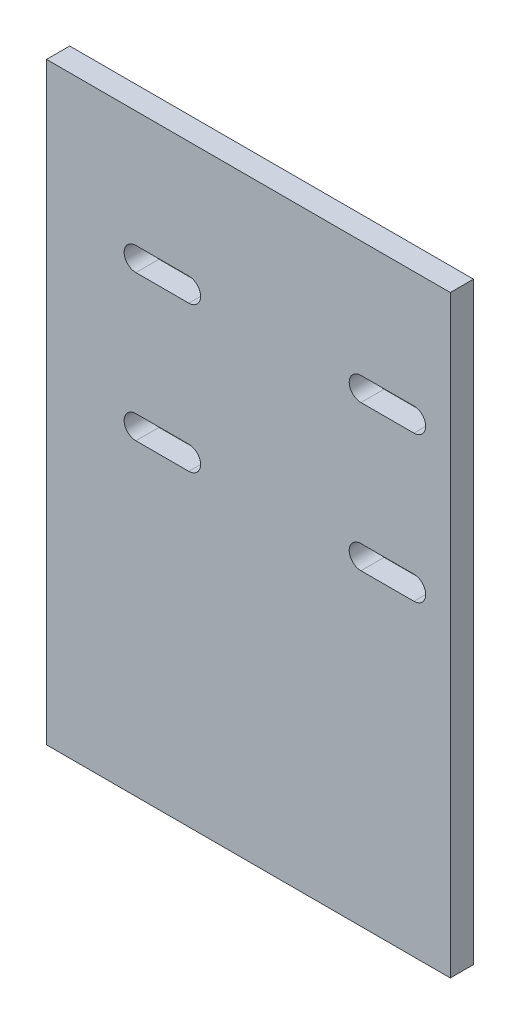
ISO-10303-21;
HEADER;
FILE_DESCRIPTION(('STEP AP214'),'2;1');
FILE_NAME('part.step','',(''),(''),'','','');
FILE_SCHEMA(('AUTOMOTIVE_DESIGN { 1 0 10303 214 1 1 1 1 }'));
ENDSEC;
DATA;
#1=APPLICATION_CONTEXT('core data for automotive mechanical design processes');
#2=APPLICATION_PROTOCOL_DEFINITION('international standard','automotive_design',2000,#1);
#3=PRODUCT_CONTEXT('',#1,'mechanical');
#4=PRODUCT('Part','Part','',(#3));
#5=PRODUCT_RELATED_PRODUCT_CATEGORY('part','',(#4));
#6=PRODUCT_DEFINITION_FORMATION('','',#4);
#7=PRODUCT_DEFINITION_CONTEXT('part definition',#1,'design');
#8=PRODUCT_DEFINITION('design','',#6,#7);
#9=PRODUCT_DEFINITION_SHAPE('','',#8);
#10=(LENGTH_UNIT() NAMED_UNIT(*) SI_UNIT(.MILLI.,.METRE.));
#11=(NAMED_UNIT(*) PLANE_ANGLE_UNIT() SI_UNIT($,.RADIAN.));
#12=(NAMED_UNIT(*) SI_UNIT($,.STERADIAN.) SOLID_ANGLE_UNIT());
#13=UNCERTAINTY_MEASURE_WITH_UNIT(LENGTH_MEASURE(1.E-05),#10,'distance_accuracy_value','');
#14=(GEOMETRIC_REPRESENTATION_CONTEXT(3) GLOBAL_UNCERTAINTY_ASSIGNED_CONTEXT((#13)) GLOBAL_UNIT_ASSIGNED_CONTEXT((#10,
#11,#12)) REPRESENTATION_CONTEXT('',''));
#15=CARTESIAN_POINT('',(0.,0.,0.));
#16=DIRECTION('',(0.,0.,1.));
#17=DIRECTION('',(1.,0.,0.));
#18=AXIS2_PLACEMENT_3D('',#15,#16,#17);
#19=CARTESIAN_POINT('',(0.,0.,20.3336867373069));
#20=DIRECTION('',(0.,0.,-1.));
#21=DIRECTION('',(-1.,0.,0.));
#22=AXIS2_PLACEMENT_3D('',#19,#20,#21);
#23=PLANE('',#22);
#24=CARTESIAN_POINT('',(276.111686737359,-157.1909,20.3336867373069));
#25=DIRECTION('',(0.,0.,1.));
#26=DIRECTION('',(1.,0.,0.));
#27=AXIS2_PLACEMENT_3D('',#24,#25,#26);
#28=CIRCLE('',#27,5.63562500000001);
#29=CARTESIAN_POINT('',(276.111686737359,-162.826525,20.3336867373069));
#30=VERTEX_POINT('',#29);
#31=CARTESIAN_POINT('',(276.111686737359,-151.555275,20.3336867373069));
#32=VERTEX_POINT('',#31);
#33=EDGE_CURVE('E282',#30,#32,#28,.T.);
#34=ORIENTED_EDGE('',*,*,#33,.T.);
#35=DIRECTION('',(1.,0.,0.));
#36=VECTOR('',#35,1.);
#37=CARTESIAN_POINT('',(0.,-151.555275,20.3336867373069));
#38=LINE('',#37,#36);
#39=CARTESIAN_POINT('',(250.711686737359,-151.555275,20.3336867373069));
#40=VERTEX_POINT('',#39);
#41=EDGE_CURVE('E274',#40,#32,#38,.T.);
#42=ORIENTED_EDGE('',*,*,#41,.F.);
#43=CARTESIAN_POINT('',(250.711686737359,-157.1909,20.3336867373069));
#44=DIRECTION('',(0.,0.,1.));
#45=DIRECTION('',(1.,0.,0.));
#46=AXIS2_PLACEMENT_3D('',#43,#44,#45);
#47=CIRCLE('',#46,5.63562500000001);
#48=CARTESIAN_POINT('',(250.711686737359,-162.826525,20.3336867373069));
#49=VERTEX_POINT('',#48);
#50=EDGE_CURVE('E152',#40,#49,#47,.T.);
#51=ORIENTED_EDGE('',*,*,#50,.T.);
#52=DIRECTION('',(1.,0.,0.));
#53=VECTOR('',#52,1.);
#54=CARTESIAN_POINT('',(0.,-162.826525,20.3336867373069));
#55=LINE('',#54,#53);
#56=EDGE_CURVE('E287',#49,#30,#55,.T.);
#57=ORIENTED_EDGE('',*,*,#56,.T.);
#58=EDGE_LOOP('',(#34,#42,#51,#57));
#59=FACE_BOUND('',#58,.T.);
#60=CARTESIAN_POINT('',(276.111686737359,-87.3409000000003,20.3336867373069));
#61=DIRECTION('',(0.,0.,1.));
#62=DIRECTION('',(1.,0.,0.));
#63=AXIS2_PLACEMENT_3D('',#60,#61,#62);
#64=CIRCLE('',#63,5.63562499999995);
#65=CARTESIAN_POINT('',(276.111686737359,-92.9765250000003,20.3336867373069));
#66=VERTEX_POINT('',#65);
#67=CARTESIAN_POINT('',(276.111686737359,-81.7052750000004,20.3336867373069));
#68=VERTEX_POINT('',#67);
#69=EDGE_CURVE('E310',#66,#68,#64,.T.);
#70=ORIENTED_EDGE('',*,*,#69,.T.);
#71=DIRECTION('',(1.,0.,0.));
#72=VECTOR('',#71,1.);
#73=CARTESIAN_POINT('',(0.,-81.7052750000004,20.3336867373069));
#74=LINE('',#73,#72);
#75=CARTESIAN_POINT('',(250.711686737359,-81.7052750000004,20.3336867373069));
#76=VERTEX_POINT('',#75);
#77=EDGE_CURVE('E313',#76,#68,#74,.T.);
#78=ORIENTED_EDGE('',*,*,#77,.F.);
#79=CARTESIAN_POINT('',(250.711686737359,-87.3409000000003,20.3336867373069));
#80=DIRECTION('',(0.,0.,1.));
#81=DIRECTION('',(1.,0.,0.));
#82=AXIS2_PLACEMENT_3D('',#79,#80,#81);
#83=CIRCLE('',#82,5.63562499999995);
#84=CARTESIAN_POINT('',(250.711686737359,-92.9765250000003,20.3336867373069));
#85=VERTEX_POINT('',#84);
#86=EDGE_CURVE('E316',#76,#85,#83,.T.);
#87=ORIENTED_EDGE('',*,*,#86,.T.);
#88=DIRECTION('',(1.,0.,0.));
#89=VECTOR('',#88,1.);
#90=CARTESIAN_POINT('',(0.,-92.9765250000003,20.3336867373069));
#91=LINE('',#90,#89);
#92=EDGE_CURVE('E319',#85,#66,#91,.T.);
#93=ORIENTED_EDGE('',*,*,#92,.T.);
#94=EDGE_LOOP('',(#70,#78,#87,#93));
#95=FACE_BOUND('',#94,.T.);
#96=CARTESIAN_POINT('',(142.761686737359,-87.3409000000003,20.3336867373069));
#97=DIRECTION('',(0.,0.,1.));
#98=DIRECTION('',(1.,0.,0.));
#99=AXIS2_PLACEMENT_3D('',#96,#97,#98);
#100=CIRCLE('',#99,5.63562499999994);
#101=CARTESIAN_POINT('',(142.761686737359,-81.7052750000004,20.3336867373069));
#102=VERTEX_POINT('',#101);
#103=CARTESIAN_POINT('',(142.761686737359,-92.9765250000003,20.3336867373069));
#104=VERTEX_POINT('',#103);
#105=EDGE_CURVE('E341',#102,#104,#100,.T.);
#106=ORIENTED_EDGE('',*,*,#105,.T.);
#107=DIRECTION('',(-1.,0.,0.));
#108=VECTOR('',#107,1.);
#109=CARTESIAN_POINT('',(0.,-92.9765250000003,20.3336867373069));
#110=LINE('',#109,#108);
#111=CARTESIAN_POINT('',(168.161686737359,-92.9765250000003,20.3336867373069));
#112=VERTEX_POINT('',#111);
#113=EDGE_CURVE('E344',#112,#104,#110,.T.);
#114=ORIENTED_EDGE('',*,*,#113,.F.);
#115=CARTESIAN_POINT('',(168.161686737359,-87.3409000000003,20.3336867373069));
#116=DIRECTION('',(0.,0.,1.));
#117=DIRECTION('',(1.,0.,0.));
#118=AXIS2_PLACEMENT_3D('',#115,#116,#117);
#119=CIRCLE('',#118,5.63562499999994);
#120=CARTESIAN_POINT('',(168.161686737359,-81.7052750000004,20.3336867373069));
#121=VERTEX_POINT('',#120);
#122=EDGE_CURVE('E347',#112,#121,#119,.T.);
#123=ORIENTED_EDGE('',*,*,#122,.T.);
#124=DIRECTION('',(-1.,0.,0.));
#125=VECTOR('',#124,1.);
#126=CARTESIAN_POINT('',(0.,-81.7052750000004,20.3336867373069));
#127=LINE('',#126,#125);
#128=EDGE_CURVE('E350',#121,#102,#127,.T.);
#129=ORIENTED_EDGE('',*,*,#128,.T.);
#130=EDGE_LOOP('',(#106,#114,#123,#129));
#131=FACE_BOUND('',#130,.T.);
#132=DIRECTION('',(-1.,0.,0.));
#133=VECTOR('',#132,1.);
#134=CARTESIAN_POINT('',(0.,-310.565800000011,20.3336867373069));
#135=LINE('',#134,#133);
#136=CARTESIAN_POINT('',(293.574186737359,-310.565800000011,20.3336867373069));
#137=VERTEX_POINT('',#136);
#138=CARTESIAN_POINT('',(99.899186737332,-310.565800000011,20.3336867373069));
#139=VERTEX_POINT('',#138);
#140=EDGE_CURVE('E404',#137,#139,#135,.T.);
#141=ORIENTED_EDGE('',*,*,#140,.T.);
#142=DIRECTION('',(0.,1.,0.));
#143=VECTOR('',#142,1.);
#144=CARTESIAN_POINT('',(99.899186737332,0.,20.3336867373069));
#145=LINE('',#144,#143);
#146=CARTESIAN_POINT('',(99.899186737332,-25.8474999999976,20.3336867373069));
#147=VERTEX_POINT('',#146);
#148=EDGE_CURVE('E407',#139,#147,#145,.T.);
#149=ORIENTED_EDGE('',*,*,#148,.T.);
#150=DIRECTION('',(-1.,0.,0.));
#151=VECTOR('',#150,1.);
#152=CARTESIAN_POINT('',(0.,-25.8474999999976,20.3336867373069));
#153=LINE('',#152,#151);
#154=CARTESIAN_POINT('',(293.574186737359,-25.8474999999976,20.3336867373069));
#155=VERTEX_POINT('',#154);
#156=EDGE_CURVE('E410',#155,#147,#153,.T.);
#157=ORIENTED_EDGE('',*,*,#156,.F.);
#158=DIRECTION('',(0.,1.,0.));
#159=VECTOR('',#158,1.);
#160=CARTESIAN_POINT('',(293.574186737359,0.,20.3336867373069));
#161=LINE('',#160,#159);
#162=EDGE_CURVE('E413',#137,#155,#161,.T.);
#163=ORIENTED_EDGE('',*,*,#162,.F.);
#164=EDGE_LOOP('',(#141,#149,#157,#163));
#165=FACE_BOUND('',#164,.T.);
#166=CARTESIAN_POINT('',(142.761686737359,-157.1909,20.3336867373069));
#167=DIRECTION('',(0.,0.,1.));
#168=DIRECTION('',(1.,0.,0.));
#169=AXIS2_PLACEMENT_3D('',#166,#167,#168);
#170=CIRCLE('',#169,5.63562500000001);
#171=CARTESIAN_POINT('',(142.761686737359,-151.555275,20.3336867373069));
#172=VERTEX_POINT('',#171);
#173=CARTESIAN_POINT('',(142.761686737359,-162.826525,20.3336867373069));
#174=VERTEX_POINT('',#173);
#175=EDGE_CURVE('E374',#172,#174,#170,.T.);
#176=ORIENTED_EDGE('',*,*,#175,.T.);
#177=DIRECTION('',(-1.,0.,0.));
#178=VECTOR('',#177,1.);
#179=CARTESIAN_POINT('',(0.,-162.826525,20.3336867373069));
#180=LINE('',#179,#178);
#181=CARTESIAN_POINT('',(168.161686737359,-162.826525,20.3336867373069));
#182=VERTEX_POINT('',#181);
#183=EDGE_CURVE('E372',#182,#174,#180,.T.);
#184=ORIENTED_EDGE('',*,*,#183,.F.);
#185=CARTESIAN_POINT('',(168.161686737359,-157.1909,20.3336867373069));
#186=DIRECTION('',(0.,0.,1.));
#187=DIRECTION('',(1.,0.,0.));
#188=AXIS2_PLACEMENT_3D('',#185,#186,#187);
#189=CIRCLE('',#188,5.63562500000001);
#190=CARTESIAN_POINT('',(168.161686737359,-151.555275,20.3336867373069));
#191=VERTEX_POINT('',#190);
#192=EDGE_CURVE('E381',#182,#191,#189,.T.);
#193=ORIENTED_EDGE('',*,*,#192,.T.);
#194=DIRECTION('',(-1.,0.,0.));
#195=VECTOR('',#194,1.);
#196=CARTESIAN_POINT('',(0.,-151.555275,20.3336867373069));
#197=LINE('',#196,#195);
#198=EDGE_CURVE('E378',#191,#172,#197,.T.);
#199=ORIENTED_EDGE('',*,*,#198,.T.);
#200=EDGE_LOOP('',(#176,#184,#193,#199));
#201=FACE_BOUND('',#200,.T.);
#202=ADVANCED_FACE('F137',(#59,#95,#131,#165,#201),#23,.T.);
#203=CARTESIAN_POINT('',(0.,0.,31.4461867373068));
#204=DIRECTION('',(0.,0.,-1.));
#205=DIRECTION('',(-1.,0.,0.));
#206=AXIS2_PLACEMENT_3D('',#203,#204,#205);
#207=PLANE('',#206);
#208=DIRECTION('',(1.,0.,0.));
#209=VECTOR('',#208,1.);
#210=CARTESIAN_POINT('',(0.,-151.555275,31.4461867373068));
#211=LINE('',#210,#209);
#212=CARTESIAN_POINT('',(250.711686737359,-151.555275,31.4461867373068));
#213=VERTEX_POINT('',#212);
#214=CARTESIAN_POINT('',(276.111686737359,-151.555275,31.4461867373068));
#215=VERTEX_POINT('',#214);
#216=EDGE_CURVE('E300',#213,#215,#211,.T.);
#217=ORIENTED_EDGE('',*,*,#216,.T.);
#218=CARTESIAN_POINT('',(276.111686737359,-157.1909,31.4461867373068));
#219=DIRECTION('',(0.,0.,1.));
#220=DIRECTION('',(1.,0.,0.));
#221=AXIS2_PLACEMENT_3D('',#218,#219,#220);
#222=CIRCLE('',#221,5.63562500000001);
#223=CARTESIAN_POINT('',(276.111686737359,-162.826525,31.4461867373068));
#224=VERTEX_POINT('',#223);
#225=EDGE_CURVE('E160',#224,#215,#222,.T.);
#226=ORIENTED_EDGE('',*,*,#225,.F.);
#227=DIRECTION('',(1.,0.,0.));
#228=VECTOR('',#227,1.);
#229=CARTESIAN_POINT('',(0.,-162.826525,31.4461867373068));
#230=LINE('',#229,#228);
#231=CARTESIAN_POINT('',(250.711686737359,-162.826525,31.4461867373068));
#232=VERTEX_POINT('',#231);
#233=EDGE_CURVE('E291',#232,#224,#230,.T.);
#234=ORIENTED_EDGE('',*,*,#233,.F.);
#235=CARTESIAN_POINT('',(250.711686737359,-157.1909,31.4461867373068));
#236=DIRECTION('',(0.,0.,1.));
#237=DIRECTION('',(1.,0.,0.));
#238=AXIS2_PLACEMENT_3D('',#235,#236,#237);
#239=CIRCLE('',#238,5.63562500000001);
#240=EDGE_CURVE('E294',#213,#232,#239,.T.);
#241=ORIENTED_EDGE('',*,*,#240,.F.);
#242=EDGE_LOOP('',(#217,#226,#234,#241));
#243=FACE_BOUND('',#242,.T.);
#244=DIRECTION('',(1.,0.,0.));
#245=VECTOR('',#244,1.);
#246=CARTESIAN_POINT('',(0.,-81.7052750000004,31.4461867373068));
#247=LINE('',#246,#245);
#248=CARTESIAN_POINT('',(250.711686737359,-81.7052750000004,31.4461867373068));
#249=VERTEX_POINT('',#248);
#250=CARTESIAN_POINT('',(276.111686737359,-81.7052750000004,31.4461867373068));
#251=VERTEX_POINT('',#250);
#252=EDGE_CURVE('E324',#249,#251,#247,.T.);
#253=ORIENTED_EDGE('',*,*,#252,.T.);
#254=CARTESIAN_POINT('',(276.111686737359,-87.3409000000003,31.4461867373068));
#255=DIRECTION('',(0.,0.,1.));
#256=DIRECTION('',(1.,0.,0.));
#257=AXIS2_PLACEMENT_3D('',#254,#255,#256);
#258=CIRCLE('',#257,5.63562499999995);
#259=CARTESIAN_POINT('',(276.111686737359,-92.9765250000003,31.4461867373068));
#260=VERTEX_POINT('',#259);
#261=EDGE_CURVE('E306',#260,#251,#258,.T.);
#262=ORIENTED_EDGE('',*,*,#261,.F.);
#263=DIRECTION('',(1.,0.,0.));
#264=VECTOR('',#263,1.);
#265=CARTESIAN_POINT('',(0.,-92.9765250000003,31.4461867373068));
#266=LINE('',#265,#264);
#267=CARTESIAN_POINT('',(250.711686737359,-92.9765250000003,31.4461867373068));
#268=VERTEX_POINT('',#267);
#269=EDGE_CURVE('E314',#268,#260,#266,.T.);
#270=ORIENTED_EDGE('',*,*,#269,.F.);
#271=CARTESIAN_POINT('',(250.711686737359,-87.3409000000003,31.4461867373068));
#272=DIRECTION('',(0.,0.,1.));
#273=DIRECTION('',(1.,0.,0.));
#274=AXIS2_PLACEMENT_3D('',#271,#272,#273);
#275=CIRCLE('',#274,5.63562499999995);
#276=EDGE_CURVE('E327',#249,#268,#275,.T.);
#277=ORIENTED_EDGE('',*,*,#276,.F.);
#278=EDGE_LOOP('',(#253,#262,#270,#277));
#279=FACE_BOUND('',#278,.T.);
#280=DIRECTION('',(-1.,0.,0.));
#281=VECTOR('',#280,1.);
#282=CARTESIAN_POINT('',(0.,-92.9765250000003,31.4461867373068));
#283=LINE('',#282,#281);
#284=CARTESIAN_POINT('',(168.161686737359,-92.9765250000003,31.4461867373068));
#285=VERTEX_POINT('',#284);
#286=CARTESIAN_POINT('',(142.761686737359,-92.9765250000003,31.4461867373068));
#287=VERTEX_POINT('',#286);
#288=EDGE_CURVE('E355',#285,#287,#283,.T.);
#289=ORIENTED_EDGE('',*,*,#288,.T.);
#290=CARTESIAN_POINT('',(142.761686737359,-87.3409000000003,31.4461867373068));
#291=DIRECTION('',(0.,0.,1.));
#292=DIRECTION('',(1.,0.,0.));
#293=AXIS2_PLACEMENT_3D('',#290,#291,#292);
#294=CIRCLE('',#293,5.63562499999994);
#295=CARTESIAN_POINT('',(142.761686737359,-81.7052750000004,31.4461867373068));
#296=VERTEX_POINT('',#295);
#297=EDGE_CURVE('E334',#296,#287,#294,.T.);
#298=ORIENTED_EDGE('',*,*,#297,.F.);
#299=DIRECTION('',(-1.,0.,0.));
#300=VECTOR('',#299,1.);
#301=CARTESIAN_POINT('',(0.,-81.7052750000004,31.4461867373068));
#302=LINE('',#301,#300);
#303=CARTESIAN_POINT('',(168.161686737359,-81.7052750000004,31.4461867373068));
#304=VERTEX_POINT('',#303);
#305=EDGE_CURVE('E345',#304,#296,#302,.T.);
#306=ORIENTED_EDGE('',*,*,#305,.F.);
#307=CARTESIAN_POINT('',(168.161686737359,-87.3409000000003,31.4461867373068));
#308=DIRECTION('',(0.,0.,1.));
#309=DIRECTION('',(1.,0.,0.));
#310=AXIS2_PLACEMENT_3D('',#307,#308,#309);
#311=CIRCLE('',#310,5.63562499999994);
#312=EDGE_CURVE('E358',#285,#304,#311,.T.);
#313=ORIENTED_EDGE('',*,*,#312,.F.);
#314=EDGE_LOOP('',(#289,#298,#306,#313));
#315=FACE_BOUND('',#314,.T.);
#316=DIRECTION('',(-1.,0.,0.));
#317=VECTOR('',#316,1.);
#318=CARTESIAN_POINT('',(0.,-310.565800000011,31.4461867373068));
#319=LINE('',#318,#317);
#320=CARTESIAN_POINT('',(293.574186737359,-310.565800000011,31.4461867373068));
#321=VERTEX_POINT('',#320);
#322=CARTESIAN_POINT('',(99.899186737332,-310.565800000011,31.4461867373068));
#323=VERTEX_POINT('',#322);
#324=EDGE_CURVE('E403',#321,#323,#319,.T.);
#325=ORIENTED_EDGE('',*,*,#324,.F.);
#326=DIRECTION('',(0.,1.,0.));
#327=VECTOR('',#326,1.);
#328=CARTESIAN_POINT('',(293.574186737359,0.,31.4461867373068));
#329=LINE('',#328,#327);
#330=CARTESIAN_POINT('',(293.574186737359,-25.8474999999976,31.4461867373068));
#331=VERTEX_POINT('',#330);
#332=EDGE_CURVE('E408',#321,#331,#329,.T.);
#333=ORIENTED_EDGE('',*,*,#332,.T.);
#334=DIRECTION('',(-1.,0.,0.));
#335=VECTOR('',#334,1.);
#336=CARTESIAN_POINT('',(0.,-25.8474999999976,31.4461867373068));
#337=LINE('',#336,#335);
#338=CARTESIAN_POINT('',(99.899186737332,-25.8474999999976,31.4461867373068));
#339=VERTEX_POINT('',#338);
#340=EDGE_CURVE('E422',#331,#339,#337,.T.);
#341=ORIENTED_EDGE('',*,*,#340,.T.);
#342=DIRECTION('',(0.,1.,0.));
#343=VECTOR('',#342,1.);
#344=CARTESIAN_POINT('',(99.899186737332,0.,31.4461867373068));
#345=LINE('',#344,#343);
#346=EDGE_CURVE('E419',#323,#339,#345,.T.);
#347=ORIENTED_EDGE('',*,*,#346,.F.);
#348=EDGE_LOOP('',(#325,#333,#341,#347));
#349=FACE_BOUND('',#348,.T.);
#350=DIRECTION('',(-1.,0.,0.));
#351=VECTOR('',#350,1.);
#352=CARTESIAN_POINT('',(0.,-162.826525,31.4461867373068));
#353=LINE('',#352,#351);
#354=CARTESIAN_POINT('',(168.161686737359,-162.826525,31.4461867373068));
#355=VERTEX_POINT('',#354);
#356=CARTESIAN_POINT('',(142.761686737359,-162.826525,31.4461867373068));
#357=VERTEX_POINT('',#356);
#358=EDGE_CURVE('E365',#355,#357,#353,.T.);
#359=ORIENTED_EDGE('',*,*,#358,.T.);
#360=CARTESIAN_POINT('',(142.761686737359,-157.1909,31.4461867373068));
#361=DIRECTION('',(0.,0.,1.));
#362=DIRECTION('',(1.,0.,0.));
#363=AXIS2_PLACEMENT_3D('',#360,#361,#362);
#364=CIRCLE('',#363,5.63562500000001);
#365=CARTESIAN_POINT('',(142.761686737359,-151.555275,31.4461867373068));
#366=VERTEX_POINT('',#365);
#367=EDGE_CURVE('E387',#366,#357,#364,.T.);
#368=ORIENTED_EDGE('',*,*,#367,.F.);
#369=DIRECTION('',(-1.,0.,0.));
#370=VECTOR('',#369,1.);
#371=CARTESIAN_POINT('',(0.,-151.555275,31.4461867373068));
#372=LINE('',#371,#370);
#373=CARTESIAN_POINT('',(168.161686737359,-151.555275,31.4461867373068));
#374=VERTEX_POINT('',#373);
#375=EDGE_CURVE('E390',#374,#366,#372,.T.);
#376=ORIENTED_EDGE('',*,*,#375,.F.);
#377=CARTESIAN_POINT('',(168.161686737359,-157.1909,31.4461867373068));
#378=DIRECTION('',(0.,0.,1.));
#379=DIRECTION('',(1.,0.,0.));
#380=AXIS2_PLACEMENT_3D('',#377,#378,#379);
#381=CIRCLE('',#380,5.63562500000001);
#382=EDGE_CURVE('E375',#355,#374,#381,.T.);
#383=ORIENTED_EDGE('',*,*,#382,.F.);
#384=EDGE_LOOP('',(#359,#368,#376,#383));
#385=FACE_BOUND('',#384,.T.);
#386=ADVANCED_FACE('F439',(#243,#279,#315,#349,#385),#207,.F.);
#387=CARTESIAN_POINT('',(0.,-310.565800000011,20.3336867373069));
#388=DIRECTION('',(0.,1.,0.));
#389=DIRECTION('',(0.,0.,1.));
#390=AXIS2_PLACEMENT_3D('',#387,#388,#389);
#391=PLANE('',#390);
#392=ORIENTED_EDGE('',*,*,#324,.T.);
#393=DIRECTION('',(0.,0.,1.));
#394=VECTOR('',#393,1.);
#395=CARTESIAN_POINT('',(99.899186737332,-310.565800000011,20.3336867373069));
#396=LINE('',#395,#394);
#397=EDGE_CURVE('E12',#139,#323,#396,.T.);
#398=ORIENTED_EDGE('',*,*,#397,.F.);
#399=ORIENTED_EDGE('',*,*,#140,.F.);
#400=DIRECTION('',(0.,0.,1.));
#401=VECTOR('',#400,1.);
#402=CARTESIAN_POINT('',(293.574186737359,-310.565800000011,20.3336867373069));
#403=LINE('',#402,#401);
#404=EDGE_CURVE('E416',#137,#321,#403,.T.);
#405=ORIENTED_EDGE('',*,*,#404,.T.);
#406=EDGE_LOOP('',(#392,#398,#399,#405));
#407=FACE_BOUND('',#406,.T.);
#408=ADVANCED_FACE('F139',(#407),#391,.F.);
#409=CARTESIAN_POINT('',(99.899186737332,0.,20.3336867373069));
#410=DIRECTION('',(1.,0.,0.));
#411=DIRECTION('',(0.,1.,0.));
#412=AXIS2_PLACEMENT_3D('',#409,#410,#411);
#413=PLANE('',#412);
#414=ORIENTED_EDGE('',*,*,#346,.T.);
#415=DIRECTION('',(0.,0.,1.));
#416=VECTOR('',#415,1.);
#417=CARTESIAN_POINT('',(99.899186737332,-25.8474999999976,20.3336867373069));
#418=LINE('',#417,#416);
#419=EDGE_CURVE('E145',#147,#339,#418,.T.);
#420=ORIENTED_EDGE('',*,*,#419,.F.);
#421=ORIENTED_EDGE('',*,*,#148,.F.);
#422=ORIENTED_EDGE('',*,*,#397,.T.);
#423=EDGE_LOOP('',(#414,#420,#421,#422));
#424=FACE_BOUND('',#423,.T.);
#425=ADVANCED_FACE('F435',(#424),#413,.F.);
#426=CARTESIAN_POINT('',(0.,-25.8474999999976,20.3336867373069));
#427=DIRECTION('',(0.,1.,0.));
#428=DIRECTION('',(0.,0.,1.));
#429=AXIS2_PLACEMENT_3D('',#426,#427,#428);
#430=PLANE('',#429);
#431=ORIENTED_EDGE('',*,*,#340,.F.);
#432=DIRECTION('',(0.,0.,1.));
#433=VECTOR('',#432,1.);
#434=CARTESIAN_POINT('',(293.574186737359,-25.8474999999976,20.3336867373069));
#435=LINE('',#434,#433);
#436=EDGE_CURVE('E428',#155,#331,#435,.T.);
#437=ORIENTED_EDGE('',*,*,#436,.F.);
#438=ORIENTED_EDGE('',*,*,#156,.T.);
#439=ORIENTED_EDGE('',*,*,#419,.T.);
#440=EDGE_LOOP('',(#431,#437,#438,#439));
#441=FACE_BOUND('',#440,.T.);
#442=ADVANCED_FACE('F432',(#441),#430,.T.);
#443=CARTESIAN_POINT('',(293.574186737359,0.,20.3336867373069));
#444=DIRECTION('',(1.,0.,0.));
#445=DIRECTION('',(0.,0.,-1.));
#446=AXIS2_PLACEMENT_3D('',#443,#444,#445);
#447=PLANE('',#446);
#448=ORIENTED_EDGE('',*,*,#332,.F.);
#449=ORIENTED_EDGE('',*,*,#404,.F.);
#450=ORIENTED_EDGE('',*,*,#162,.T.);
#451=ORIENTED_EDGE('',*,*,#436,.T.);
#452=EDGE_LOOP('',(#448,#449,#450,#451));
#453=FACE_BOUND('',#452,.T.);
#454=ADVANCED_FACE('F443',(#453),#447,.T.);
#455=CARTESIAN_POINT('',(0.,-162.826525,20.3336867373069));
#456=DIRECTION('',(0.,1.,0.));
#457=DIRECTION('',(0.,0.,1.));
#458=AXIS2_PLACEMENT_3D('',#455,#456,#457);
#459=PLANE('',#458);
#460=ORIENTED_EDGE('',*,*,#358,.F.);
#461=DIRECTION('',(0.,0.,1.));
#462=VECTOR('',#461,1.);
#463=CARTESIAN_POINT('',(168.161686737359,-162.826525,20.3336867373069));
#464=LINE('',#463,#462);
#465=EDGE_CURVE('E384',#182,#355,#464,.T.);
#466=ORIENTED_EDGE('',*,*,#465,.F.);
#467=ORIENTED_EDGE('',*,*,#183,.T.);
#468=DIRECTION('',(0.,0.,1.));
#469=VECTOR('',#468,1.);
#470=CARTESIAN_POINT('',(142.761686737359,-162.826525,20.3336867373069));
#471=LINE('',#470,#469);
#472=EDGE_CURVE('E401',#174,#357,#471,.T.);
#473=ORIENTED_EDGE('',*,*,#472,.T.);
#474=EDGE_LOOP('',(#460,#466,#467,#473));
#475=FACE_BOUND('',#474,.T.);
#476=ADVANCED_FACE('F461',(#475),#459,.T.);
#477=CARTESIAN_POINT('',(142.761686737359,-157.1909,20.3336867373069));
#478=DIRECTION('',(0.,0.,1.));
#479=DIRECTION('',(1.,0.,0.));
#480=AXIS2_PLACEMENT_3D('',#477,#478,#479);
#481=CYLINDRICAL_SURFACE('',#480,5.63562500000001);
#482=ORIENTED_EDGE('',*,*,#367,.T.);
#483=ORIENTED_EDGE('',*,*,#472,.F.);
#484=ORIENTED_EDGE('',*,*,#175,.F.);
#485=DIRECTION('',(0.,0.,1.));
#486=VECTOR('',#485,1.);
#487=CARTESIAN_POINT('',(142.761686737359,-151.555275,20.3336867373069));
#488=LINE('',#487,#486);
#489=EDGE_CURVE('E399',#172,#366,#488,.T.);
#490=ORIENTED_EDGE('',*,*,#489,.T.);
#491=EDGE_LOOP('',(#482,#483,#484,#490));
#492=FACE_BOUND('',#491,.T.);
#493=ADVANCED_FACE('F483',(#492),#481,.F.);
#494=CARTESIAN_POINT('',(0.,-151.555275,20.3336867373069));
#495=DIRECTION('',(0.,1.,0.));
#496=DIRECTION('',(0.,0.,1.));
#497=AXIS2_PLACEMENT_3D('',#494,#495,#496);
#498=PLANE('',#497);
#499=ORIENTED_EDGE('',*,*,#375,.T.);
#500=ORIENTED_EDGE('',*,*,#489,.F.);
#501=ORIENTED_EDGE('',*,*,#198,.F.);
#502=DIRECTION('',(0.,0.,1.));
#503=VECTOR('',#502,1.);
#504=CARTESIAN_POINT('',(168.161686737359,-151.555275,20.3336867373069));
#505=LINE('',#504,#503);
#506=EDGE_CURVE('E397',#191,#374,#505,.T.);
#507=ORIENTED_EDGE('',*,*,#506,.T.);
#508=EDGE_LOOP('',(#499,#500,#501,#507));
#509=FACE_BOUND('',#508,.T.);
#510=ADVANCED_FACE('F491',(#509),#498,.F.);
#511=CARTESIAN_POINT('',(168.161686737359,-157.1909,20.3336867373069));
#512=DIRECTION('',(0.,0.,1.));
#513=DIRECTION('',(1.,0.,0.));
#514=AXIS2_PLACEMENT_3D('',#511,#512,#513);
#515=CYLINDRICAL_SURFACE('',#514,5.63562500000001);
#516=ORIENTED_EDGE('',*,*,#382,.T.);
#517=ORIENTED_EDGE('',*,*,#506,.F.);
#518=ORIENTED_EDGE('',*,*,#192,.F.);
#519=ORIENTED_EDGE('',*,*,#465,.T.);
#520=EDGE_LOOP('',(#516,#517,#518,#519));
#521=FACE_BOUND('',#520,.T.);
#522=ADVANCED_FACE('F499',(#521),#515,.F.);
#523=CARTESIAN_POINT('',(142.761686737359,-87.3409000000003,20.3336867373069));
#524=DIRECTION('',(0.,0.,1.));
#525=DIRECTION('',(1.,0.,0.));
#526=AXIS2_PLACEMENT_3D('',#523,#524,#525);
#527=CYLINDRICAL_SURFACE('',#526,5.63562499999994);
#528=ORIENTED_EDGE('',*,*,#297,.T.);
#529=DIRECTION('',(0.,0.,1.));
#530=VECTOR('',#529,1.);
#531=CARTESIAN_POINT('',(142.761686737359,-92.9765250000003,20.3336867373069));
#532=LINE('',#531,#530);
#533=EDGE_CURVE('E353',#104,#287,#532,.T.);
#534=ORIENTED_EDGE('',*,*,#533,.F.);
#535=ORIENTED_EDGE('',*,*,#105,.F.);
#536=DIRECTION('',(0.,0.,1.));
#537=VECTOR('',#536,1.);
#538=CARTESIAN_POINT('',(142.761686737359,-81.7052750000004,20.3336867373069));
#539=LINE('',#538,#537);
#540=EDGE_CURVE('E363',#102,#296,#539,.T.);
#541=ORIENTED_EDGE('',*,*,#540,.T.);
#542=EDGE_LOOP('',(#528,#534,#535,#541));
#543=FACE_BOUND('',#542,.T.);
#544=ADVANCED_FACE('F508',(#543),#527,.F.);
#545=CARTESIAN_POINT('',(0.,-81.7052750000004,20.3336867373069));
#546=DIRECTION('',(0.,1.,0.));
#547=DIRECTION('',(0.,0.,1.));
#548=AXIS2_PLACEMENT_3D('',#545,#546,#547);
#549=PLANE('',#548);
#550=ORIENTED_EDGE('',*,*,#305,.T.);
#551=ORIENTED_EDGE('',*,*,#540,.F.);
#552=ORIENTED_EDGE('',*,*,#128,.F.);
#553=DIRECTION('',(0.,0.,1.));
#554=VECTOR('',#553,1.);
#555=CARTESIAN_POINT('',(168.161686737359,-81.7052750000004,20.3336867373069));
#556=LINE('',#555,#554);
#557=EDGE_CURVE('E366',#121,#304,#556,.T.);
#558=ORIENTED_EDGE('',*,*,#557,.T.);
#559=EDGE_LOOP('',(#550,#551,#552,#558));
#560=FACE_BOUND('',#559,.T.);
#561=ADVANCED_FACE('F517',(#560),#549,.F.);
#562=CARTESIAN_POINT('',(168.161686737359,-87.3409000000003,20.3336867373069));
#563=DIRECTION('',(0.,0.,1.));
#564=DIRECTION('',(1.,0.,0.));
#565=AXIS2_PLACEMENT_3D('',#562,#563,#564);
#566=CYLINDRICAL_SURFACE('',#565,5.63562499999994);
#567=ORIENTED_EDGE('',*,*,#312,.T.);
#568=ORIENTED_EDGE('',*,*,#557,.F.);
#569=ORIENTED_EDGE('',*,*,#122,.F.);
#570=DIRECTION('',(0.,0.,1.));
#571=VECTOR('',#570,1.);
#572=CARTESIAN_POINT('',(168.161686737359,-92.9765250000003,20.3336867373069));
#573=LINE('',#572,#571);
#574=EDGE_CURVE('E368',#112,#285,#573,.T.);
#575=ORIENTED_EDGE('',*,*,#574,.T.);
#576=EDGE_LOOP('',(#567,#568,#569,#575));
#577=FACE_BOUND('',#576,.T.);
#578=ADVANCED_FACE('F526',(#577),#566,.F.);
#579=CARTESIAN_POINT('',(0.,-92.9765250000003,20.3336867373069));
#580=DIRECTION('',(0.,1.,0.));
#581=DIRECTION('',(0.,0.,1.));
#582=AXIS2_PLACEMENT_3D('',#579,#580,#581);
#583=PLANE('',#582);
#584=ORIENTED_EDGE('',*,*,#288,.F.);
#585=ORIENTED_EDGE('',*,*,#574,.F.);
#586=ORIENTED_EDGE('',*,*,#113,.T.);
#587=ORIENTED_EDGE('',*,*,#533,.T.);
#588=EDGE_LOOP('',(#584,#585,#586,#587));
#589=FACE_BOUND('',#588,.T.);
#590=ADVANCED_FACE('F535',(#589),#583,.T.);
#591=CARTESIAN_POINT('',(276.111686737359,-87.3409000000003,20.3336867373069));
#592=DIRECTION('',(0.,0.,1.));
#593=DIRECTION('',(1.,0.,0.));
#594=AXIS2_PLACEMENT_3D('',#591,#592,#593);
#595=CYLINDRICAL_SURFACE('',#594,5.63562499999995);
#596=ORIENTED_EDGE('',*,*,#261,.T.);
#597=DIRECTION('',(0.,0.,1.));
#598=VECTOR('',#597,1.);
#599=CARTESIAN_POINT('',(276.111686737359,-81.7052750000004,20.3336867373069));
#600=LINE('',#599,#598);
#601=EDGE_CURVE('E322',#68,#251,#600,.T.);
#602=ORIENTED_EDGE('',*,*,#601,.F.);
#603=ORIENTED_EDGE('',*,*,#69,.F.);
#604=DIRECTION('',(0.,0.,1.));
#605=VECTOR('',#604,1.);
#606=CARTESIAN_POINT('',(276.111686737359,-92.9765250000003,20.3336867373069));
#607=LINE('',#606,#605);
#608=EDGE_CURVE('E332',#66,#260,#607,.T.);
#609=ORIENTED_EDGE('',*,*,#608,.T.);
#610=EDGE_LOOP('',(#596,#602,#603,#609));
#611=FACE_BOUND('',#610,.T.);
#612=ADVANCED_FACE('F544',(#611),#595,.F.);
#613=CARTESIAN_POINT('',(0.,-92.9765250000003,20.3336867373069));
#614=DIRECTION('',(0.,-1.,0.));
#615=DIRECTION('',(0.,0.,-1.));
#616=AXIS2_PLACEMENT_3D('',#613,#614,#615);
#617=PLANE('',#616);
#618=ORIENTED_EDGE('',*,*,#269,.T.);
#619=ORIENTED_EDGE('',*,*,#608,.F.);
#620=ORIENTED_EDGE('',*,*,#92,.F.);
#621=DIRECTION('',(0.,0.,1.));
#622=VECTOR('',#621,1.);
#623=CARTESIAN_POINT('',(250.711686737359,-92.9765250000003,20.3336867373069));
#624=LINE('',#623,#622);
#625=EDGE_CURVE('E335',#85,#268,#624,.T.);
#626=ORIENTED_EDGE('',*,*,#625,.T.);
#627=EDGE_LOOP('',(#618,#619,#620,#626));
#628=FACE_BOUND('',#627,.T.);
#629=ADVANCED_FACE('F553',(#628),#617,.F.);
#630=CARTESIAN_POINT('',(250.711686737359,-87.3409000000003,20.3336867373069));
#631=DIRECTION('',(0.,0.,1.));
#632=DIRECTION('',(1.,0.,0.));
#633=AXIS2_PLACEMENT_3D('',#630,#631,#632);
#634=CYLINDRICAL_SURFACE('',#633,5.63562499999995);
#635=ORIENTED_EDGE('',*,*,#276,.T.);
#636=ORIENTED_EDGE('',*,*,#625,.F.);
#637=ORIENTED_EDGE('',*,*,#86,.F.);
#638=DIRECTION('',(0.,0.,1.));
#639=VECTOR('',#638,1.);
#640=CARTESIAN_POINT('',(250.711686737359,-81.7052750000004,20.3336867373069));
#641=LINE('',#640,#639);
#642=EDGE_CURVE('E337',#76,#249,#641,.T.);
#643=ORIENTED_EDGE('',*,*,#642,.T.);
#644=EDGE_LOOP('',(#635,#636,#637,#643));
#645=FACE_BOUND('',#644,.T.);
#646=ADVANCED_FACE('F562',(#645),#634,.F.);
#647=CARTESIAN_POINT('',(0.,-81.7052750000004,20.3336867373069));
#648=DIRECTION('',(0.,-1.,0.));
#649=DIRECTION('',(0.,0.,-1.));
#650=AXIS2_PLACEMENT_3D('',#647,#648,#649);
#651=PLANE('',#650);
#652=ORIENTED_EDGE('',*,*,#252,.F.);
#653=ORIENTED_EDGE('',*,*,#642,.F.);
#654=ORIENTED_EDGE('',*,*,#77,.T.);
#655=ORIENTED_EDGE('',*,*,#601,.T.);
#656=EDGE_LOOP('',(#652,#653,#654,#655));
#657=FACE_BOUND('',#656,.T.);
#658=ADVANCED_FACE('F571',(#657),#651,.T.);
#659=CARTESIAN_POINT('',(276.111686737359,-157.1909,20.3336867373069));
#660=DIRECTION('',(0.,0.,1.));
#661=DIRECTION('',(1.,0.,0.));
#662=AXIS2_PLACEMENT_3D('',#659,#660,#661);
#663=CYLINDRICAL_SURFACE('',#662,5.63562500000001);
#664=ORIENTED_EDGE('',*,*,#225,.T.);
#665=DIRECTION('',(0.,0.,1.));
#666=VECTOR('',#665,1.);
#667=CARTESIAN_POINT('',(276.111686737359,-151.555275,20.3336867373069));
#668=LINE('',#667,#666);
#669=EDGE_CURVE('E277',#32,#215,#668,.T.);
#670=ORIENTED_EDGE('',*,*,#669,.F.);
#671=ORIENTED_EDGE('',*,*,#33,.F.);
#672=DIRECTION('',(0.,0.,1.));
#673=VECTOR('',#672,1.);
#674=CARTESIAN_POINT('',(276.111686737359,-162.826525,20.3336867373069));
#675=LINE('',#674,#673);
#676=EDGE_CURVE('E304',#30,#224,#675,.T.);
#677=ORIENTED_EDGE('',*,*,#676,.T.);
#678=EDGE_LOOP('',(#664,#670,#671,#677));
#679=FACE_BOUND('',#678,.T.);
#680=ADVANCED_FACE('F285',(#679),#663,.F.);
#681=CARTESIAN_POINT('',(0.,-162.826525,20.3336867373069));
#682=DIRECTION('',(0.,-1.,0.));
#683=DIRECTION('',(0.,0.,-1.));
#684=AXIS2_PLACEMENT_3D('',#681,#682,#683);
#685=PLANE('',#684);
#686=ORIENTED_EDGE('',*,*,#233,.T.);
#687=ORIENTED_EDGE('',*,*,#676,.F.);
#688=ORIENTED_EDGE('',*,*,#56,.F.);
#689=DIRECTION('',(0.,0.,1.));
#690=VECTOR('',#689,1.);
#691=CARTESIAN_POINT('',(250.711686737359,-162.826525,20.3336867373069));
#692=LINE('',#691,#690);
#693=EDGE_CURVE('E307',#49,#232,#692,.T.);
#694=ORIENTED_EDGE('',*,*,#693,.T.);
#695=EDGE_LOOP('',(#686,#687,#688,#694));
#696=FACE_BOUND('',#695,.T.);
#697=ADVANCED_FACE('F588',(#696),#685,.F.);
#698=CARTESIAN_POINT('',(250.711686737359,-157.1909,20.3336867373069));
#699=DIRECTION('',(0.,0.,1.));
#700=DIRECTION('',(1.,0.,0.));
#701=AXIS2_PLACEMENT_3D('',#698,#699,#700);
#702=CYLINDRICAL_SURFACE('',#701,5.63562500000001);
#703=ORIENTED_EDGE('',*,*,#240,.T.);
#704=ORIENTED_EDGE('',*,*,#693,.F.);
#705=ORIENTED_EDGE('',*,*,#50,.F.);
#706=DIRECTION('',(0.,0.,1.));
#707=VECTOR('',#706,1.);
#708=CARTESIAN_POINT('',(250.711686737359,-151.555275,20.3336867373069));
#709=LINE('',#708,#707);
#710=EDGE_CURVE('E279',#40,#213,#709,.T.);
#711=ORIENTED_EDGE('',*,*,#710,.T.);
#712=EDGE_LOOP('',(#703,#704,#705,#711));
#713=FACE_BOUND('',#712,.T.);
#714=ADVANCED_FACE('F596',(#713),#702,.F.);
#715=CARTESIAN_POINT('',(0.,-151.555275,20.3336867373069));
#716=DIRECTION('',(0.,-1.,0.));
#717=DIRECTION('',(0.,0.,-1.));
#718=AXIS2_PLACEMENT_3D('',#715,#716,#717);
#719=PLANE('',#718);
#720=ORIENTED_EDGE('',*,*,#216,.F.);
#721=ORIENTED_EDGE('',*,*,#710,.F.);
#722=ORIENTED_EDGE('',*,*,#41,.T.);
#723=ORIENTED_EDGE('',*,*,#669,.T.);
#724=EDGE_LOOP('',(#720,#721,#722,#723));
#725=FACE_BOUND('',#724,.T.);
#726=ADVANCED_FACE('F276',(#725),#719,.T.);
#727=CLOSED_SHELL('',(#202,#386,#408,#425,#442,#454,#476,#493,#510,#522,#544,#561,#578,#590,
#612,#629,#646,#658,#680,#697,#714,#726));
#728=MANIFOLD_SOLID_BREP('B2',#727);
#729=ADVANCED_BREP_SHAPE_REPRESENTATION('',(#18,#728),#14);
#730=SHAPE_DEFINITION_REPRESENTATION(#9,#729);
ENDSEC;
END-ISO-10303-21;
